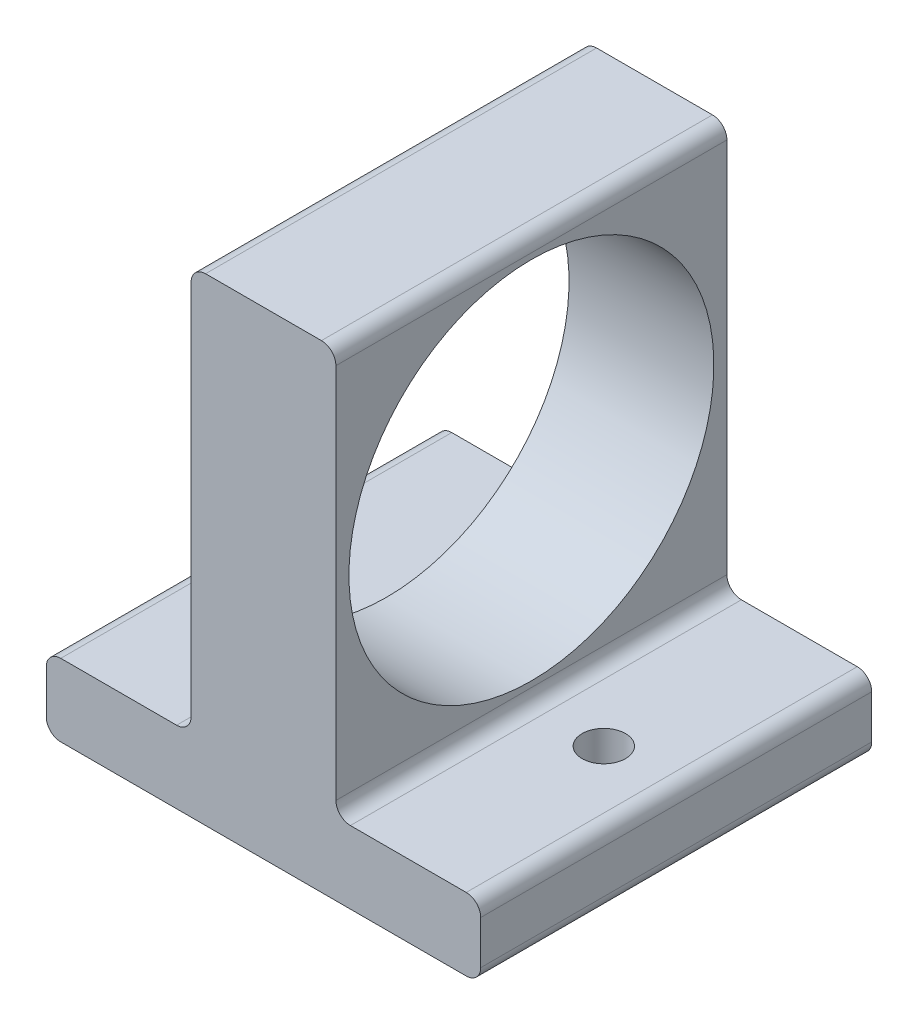
ISO-10303-21;
HEADER;
FILE_DESCRIPTION(('STEP AP214'),'2;1');
FILE_NAME('part.step','',(''),(''),'','','');
FILE_SCHEMA(('AUTOMOTIVE_DESIGN { 1 0 10303 214 1 1 1 1 }'));
ENDSEC;
DATA;
#1=APPLICATION_CONTEXT('core data for automotive mechanical design processes');
#2=APPLICATION_PROTOCOL_DEFINITION('international standard','automotive_design',2000,#1);
#3=PRODUCT_CONTEXT('',#1,'mechanical');
#4=PRODUCT('Part','Part','',(#3));
#5=PRODUCT_RELATED_PRODUCT_CATEGORY('part','',(#4));
#6=PRODUCT_DEFINITION_FORMATION('','',#4);
#7=PRODUCT_DEFINITION_CONTEXT('part definition',#1,'design');
#8=PRODUCT_DEFINITION('design','',#6,#7);
#9=PRODUCT_DEFINITION_SHAPE('','',#8);
#10=(LENGTH_UNIT() NAMED_UNIT(*) SI_UNIT(.MILLI.,.METRE.));
#11=(NAMED_UNIT(*) PLANE_ANGLE_UNIT() SI_UNIT($,.RADIAN.));
#12=(NAMED_UNIT(*) SI_UNIT($,.STERADIAN.) SOLID_ANGLE_UNIT());
#13=UNCERTAINTY_MEASURE_WITH_UNIT(LENGTH_MEASURE(1.E-05),#10,'distance_accuracy_value','');
#14=(GEOMETRIC_REPRESENTATION_CONTEXT(3) GLOBAL_UNCERTAINTY_ASSIGNED_CONTEXT((#13)) GLOBAL_UNIT_ASSIGNED_CONTEXT((#10,
#11,#12)) REPRESENTATION_CONTEXT('',''));
#15=CARTESIAN_POINT('',(0.,0.,0.));
#16=DIRECTION('',(0.,0.,1.));
#17=DIRECTION('',(1.,0.,0.));
#18=AXIS2_PLACEMENT_3D('',#15,#16,#17);
#19=CARTESIAN_POINT('',(-4.,27.,27.));
#20=DIRECTION('',(0.,0.,-1.));
#21=DIRECTION('',(-1.,0.,0.));
#22=AXIS2_PLACEMENT_3D('',#19,#20,#21);
#23=CYLINDRICAL_SURFACE('',#22,1.);
#24=CARTESIAN_POINT('',(-4.,27.,0.));
#25=DIRECTION('',(0.,0.,1.));
#26=DIRECTION('',(-1.,0.,0.));
#27=AXIS2_PLACEMENT_3D('',#24,#25,#26);
#28=CIRCLE('',#27,1.);
#29=CARTESIAN_POINT('',(-4.,28.,0.));
#30=VERTEX_POINT('',#29);
#31=CARTESIAN_POINT('',(-5.,27.,0.));
#32=VERTEX_POINT('',#31);
#33=EDGE_CURVE('E188',#30,#32,#28,.T.);
#34=ORIENTED_EDGE('',*,*,#33,.T.);
#35=DIRECTION('',(0.,0.,-1.));
#36=VECTOR('',#35,1.);
#37=CARTESIAN_POINT('',(-5.,27.,27.));
#38=LINE('',#37,#36);
#39=CARTESIAN_POINT('',(-5.,27.,27.));
#40=VERTEX_POINT('',#39);
#41=EDGE_CURVE('E11',#40,#32,#38,.T.);
#42=ORIENTED_EDGE('',*,*,#41,.F.);
#43=CARTESIAN_POINT('',(-4.,27.,27.));
#44=DIRECTION('',(0.,0.,1.));
#45=DIRECTION('',(-1.,0.,0.));
#46=AXIS2_PLACEMENT_3D('',#43,#44,#45);
#47=CIRCLE('',#46,1.);
#48=CARTESIAN_POINT('',(-4.,28.,27.));
#49=VERTEX_POINT('',#48);
#50=EDGE_CURVE('E235',#49,#40,#47,.T.);
#51=ORIENTED_EDGE('',*,*,#50,.F.);
#52=DIRECTION('',(0.,0.,-1.));
#53=VECTOR('',#52,1.);
#54=CARTESIAN_POINT('',(-4.,28.,27.));
#55=LINE('',#54,#53);
#56=EDGE_CURVE('E184',#49,#30,#55,.T.);
#57=ORIENTED_EDGE('',*,*,#56,.T.);
#58=EDGE_LOOP('',(#34,#42,#51,#57));
#59=FACE_BOUND('',#58,.T.);
#60=ADVANCED_FACE('F39',(#59),#23,.T.);
#61=CARTESIAN_POINT('',(-4.99999999999999,1.00000000000001,27.));
#62=DIRECTION('',(1.,0.,0.));
#63=DIRECTION('',(0.,1.,0.));
#64=AXIS2_PLACEMENT_3D('',#61,#62,#63);
#65=PLANE('',#64);
#66=CARTESIAN_POINT('',(-4.99999999999999,14.,13.5));
#67=DIRECTION('',(1.,0.,0.));
#68=DIRECTION('',(0.,1.,0.));
#69=AXIS2_PLACEMENT_3D('',#66,#67,#68);
#70=CIRCLE('',#69,12.6);
#71=CARTESIAN_POINT('',(-5.,26.6,13.5));
#72=VERTEX_POINT('',#71);
#73=EDGE_CURVE('E193',#72,#72,#70,.F.);
#74=ORIENTED_EDGE('',*,*,#73,.F.);
#75=EDGE_LOOP('',(#74));
#76=FACE_BOUND('',#75,.T.);
#77=DIRECTION('',(0.,-1.,0.));
#78=VECTOR('',#77,1.);
#79=CARTESIAN_POINT('',(-4.99999999999999,1.00000000000001,0.));
#80=LINE('',#79,#78);
#81=CARTESIAN_POINT('',(-4.99999999999999,1.00000000000001,0.));
#82=VERTEX_POINT('',#81);
#83=EDGE_CURVE('E192',#32,#82,#80,.T.);
#84=ORIENTED_EDGE('',*,*,#83,.T.);
#85=DIRECTION('',(0.,0.,-1.));
#86=VECTOR('',#85,1.);
#87=CARTESIAN_POINT('',(-4.99999999999999,1.00000000000001,27.));
#88=LINE('',#87,#86);
#89=CARTESIAN_POINT('',(-4.99999999999999,1.00000000000001,27.));
#90=VERTEX_POINT('',#89);
#91=EDGE_CURVE('E48',#90,#82,#88,.T.);
#92=ORIENTED_EDGE('',*,*,#91,.F.);
#93=DIRECTION('',(0.,-1.,0.));
#94=VECTOR('',#93,1.);
#95=CARTESIAN_POINT('',(-4.99999999999999,1.00000000000001,27.));
#96=LINE('',#95,#94);
#97=EDGE_CURVE('E123',#40,#90,#96,.T.);
#98=ORIENTED_EDGE('',*,*,#97,.F.);
#99=ORIENTED_EDGE('',*,*,#41,.T.);
#100=EDGE_LOOP('',(#84,#92,#98,#99));
#101=FACE_BOUND('',#100,.T.);
#102=ADVANCED_FACE('F357',(#76,#101),#65,.F.);
#103=CARTESIAN_POINT('',(-5.99999999999999,1.,27.));
#104=DIRECTION('',(0.,0.,-1.));
#105=DIRECTION('',(-1.,0.,0.));
#106=AXIS2_PLACEMENT_3D('',#103,#104,#105);
#107=CYLINDRICAL_SURFACE('',#106,1.);
#108=CARTESIAN_POINT('',(-5.99999999999999,1.,0.));
#109=DIRECTION('',(0.,0.,-1.));
#110=DIRECTION('',(1.,0.,0.));
#111=AXIS2_PLACEMENT_3D('',#108,#109,#110);
#112=CIRCLE('',#111,1.);
#113=CARTESIAN_POINT('',(-5.99999999999999,0.,0.));
#114=VERTEX_POINT('',#113);
#115=EDGE_CURVE('E196',#82,#114,#112,.T.);
#116=ORIENTED_EDGE('',*,*,#115,.T.);
#117=DIRECTION('',(0.,0.,-1.));
#118=VECTOR('',#117,1.);
#119=CARTESIAN_POINT('',(-5.99999999999999,0.,27.));
#120=LINE('',#119,#118);
#121=CARTESIAN_POINT('',(-5.99999999999999,0.,27.));
#122=VERTEX_POINT('',#121);
#123=EDGE_CURVE('E278',#122,#114,#120,.T.);
#124=ORIENTED_EDGE('',*,*,#123,.F.);
#125=CARTESIAN_POINT('',(-5.99999999999999,1.,27.));
#126=DIRECTION('',(0.,0.,-1.));
#127=DIRECTION('',(1.,0.,0.));
#128=AXIS2_PLACEMENT_3D('',#125,#126,#127);
#129=CIRCLE('',#128,1.);
#130=EDGE_CURVE('E288',#90,#122,#129,.T.);
#131=ORIENTED_EDGE('',*,*,#130,.F.);
#132=ORIENTED_EDGE('',*,*,#91,.T.);
#133=EDGE_LOOP('',(#116,#124,#131,#132));
#134=FACE_BOUND('',#133,.T.);
#135=ADVANCED_FACE('F286',(#134),#107,.F.);
#136=CARTESIAN_POINT('',(-14.,0.,27.));
#137=DIRECTION('',(0.,-1.,0.));
#138=DIRECTION('',(0.,0.,-1.));
#139=AXIS2_PLACEMENT_3D('',#136,#137,#138);
#140=PLANE('',#139);
#141=CARTESIAN_POINT('',(-10.,0.,13.5));
#142=DIRECTION('',(0.,-1.,0.));
#143=DIRECTION('',(0.,0.,-1.));
#144=AXIS2_PLACEMENT_3D('',#141,#142,#143);
#145=CIRCLE('',#144,1.5);
#146=CARTESIAN_POINT('',(-10.,0.,12.));
#147=VERTEX_POINT('',#146);
#148=EDGE_CURVE('E411',#147,#147,#145,.F.);
#149=ORIENTED_EDGE('',*,*,#148,.F.);
#150=EDGE_LOOP('',(#149));
#151=FACE_BOUND('',#150,.T.);
#152=DIRECTION('',(-1.,0.,0.));
#153=VECTOR('',#152,1.);
#154=CARTESIAN_POINT('',(-14.,0.,0.));
#155=LINE('',#154,#153);
#156=CARTESIAN_POINT('',(-14.,0.,0.));
#157=VERTEX_POINT('',#156);
#158=EDGE_CURVE('E199',#114,#157,#155,.T.);
#159=ORIENTED_EDGE('',*,*,#158,.T.);
#160=DIRECTION('',(0.,0.,-1.));
#161=VECTOR('',#160,1.);
#162=CARTESIAN_POINT('',(-14.,0.,27.));
#163=LINE('',#162,#161);
#164=CARTESIAN_POINT('',(-14.,0.,27.));
#165=VERTEX_POINT('',#164);
#166=EDGE_CURVE('E274',#165,#157,#163,.T.);
#167=ORIENTED_EDGE('',*,*,#166,.F.);
#168=DIRECTION('',(-1.,0.,0.));
#169=VECTOR('',#168,1.);
#170=CARTESIAN_POINT('',(-14.,0.,27.));
#171=LINE('',#170,#169);
#172=EDGE_CURVE('E307',#122,#165,#171,.T.);
#173=ORIENTED_EDGE('',*,*,#172,.F.);
#174=ORIENTED_EDGE('',*,*,#123,.T.);
#175=EDGE_LOOP('',(#159,#167,#173,#174));
#176=FACE_BOUND('',#175,.T.);
#177=ADVANCED_FACE('F297',(#151,#176),#140,.F.);
#178=CARTESIAN_POINT('',(-14.,-1.,27.));
#179=DIRECTION('',(0.,0.,-1.));
#180=DIRECTION('',(-1.,0.,0.));
#181=AXIS2_PLACEMENT_3D('',#178,#179,#180);
#182=CYLINDRICAL_SURFACE('',#181,1.);
#183=CARTESIAN_POINT('',(-14.,-1.,0.));
#184=DIRECTION('',(0.,0.,1.));
#185=DIRECTION('',(-1.,0.,0.));
#186=AXIS2_PLACEMENT_3D('',#183,#184,#185);
#187=CIRCLE('',#186,1.);
#188=CARTESIAN_POINT('',(-15.,-1.00000000000001,0.));
#189=VERTEX_POINT('',#188);
#190=EDGE_CURVE('E202',#157,#189,#187,.T.);
#191=ORIENTED_EDGE('',*,*,#190,.T.);
#192=DIRECTION('',(0.,0.,-1.));
#193=VECTOR('',#192,1.);
#194=CARTESIAN_POINT('',(-15.,-1.00000000000001,27.));
#195=LINE('',#194,#193);
#196=CARTESIAN_POINT('',(-15.,-1.00000000000001,27.));
#197=VERTEX_POINT('',#196);
#198=EDGE_CURVE('E270',#197,#189,#195,.T.);
#199=ORIENTED_EDGE('',*,*,#198,.F.);
#200=CARTESIAN_POINT('',(-14.,-1.,27.));
#201=DIRECTION('',(0.,0.,1.));
#202=DIRECTION('',(-1.,0.,0.));
#203=AXIS2_PLACEMENT_3D('',#200,#201,#202);
#204=CIRCLE('',#203,1.);
#205=EDGE_CURVE('E303',#165,#197,#204,.T.);
#206=ORIENTED_EDGE('',*,*,#205,.F.);
#207=ORIENTED_EDGE('',*,*,#166,.T.);
#208=EDGE_LOOP('',(#191,#199,#206,#207));
#209=FACE_BOUND('',#208,.T.);
#210=ADVANCED_FACE('F301',(#209),#182,.T.);
#211=CARTESIAN_POINT('',(-15.,-1.00000000000001,27.));
#212=DIRECTION('',(1.,0.,0.));
#213=DIRECTION('',(0.,0.,-1.));
#214=AXIS2_PLACEMENT_3D('',#211,#212,#213);
#215=PLANE('',#214);
#216=DIRECTION('',(0.,-1.,0.));
#217=VECTOR('',#216,1.);
#218=CARTESIAN_POINT('',(-15.,-1.00000000000001,0.));
#219=LINE('',#218,#217);
#220=CARTESIAN_POINT('',(-15.,-3.99999999999999,0.));
#221=VERTEX_POINT('',#220);
#222=EDGE_CURVE('E205',#189,#221,#219,.T.);
#223=ORIENTED_EDGE('',*,*,#222,.T.);
#224=DIRECTION('',(0.,0.,-1.));
#225=VECTOR('',#224,1.);
#226=CARTESIAN_POINT('',(-15.,-3.99999999999999,27.));
#227=LINE('',#226,#225);
#228=CARTESIAN_POINT('',(-15.,-3.99999999999999,27.));
#229=VERTEX_POINT('',#228);
#230=EDGE_CURVE('E266',#229,#221,#227,.T.);
#231=ORIENTED_EDGE('',*,*,#230,.F.);
#232=DIRECTION('',(0.,-1.,0.));
#233=VECTOR('',#232,1.);
#234=CARTESIAN_POINT('',(-15.,-1.00000000000001,27.));
#235=LINE('',#234,#233);
#236=EDGE_CURVE('E306',#197,#229,#235,.T.);
#237=ORIENTED_EDGE('',*,*,#236,.F.);
#238=ORIENTED_EDGE('',*,*,#198,.T.);
#239=EDGE_LOOP('',(#223,#231,#237,#238));
#240=FACE_BOUND('',#239,.T.);
#241=ADVANCED_FACE('F373',(#240),#215,.F.);
#242=CARTESIAN_POINT('',(-14.,-4.,27.));
#243=DIRECTION('',(0.,0.,-1.));
#244=DIRECTION('',(-1.,0.,0.));
#245=AXIS2_PLACEMENT_3D('',#242,#243,#244);
#246=CYLINDRICAL_SURFACE('',#245,1.);
#247=CARTESIAN_POINT('',(-14.,-4.,0.));
#248=DIRECTION('',(0.,0.,1.));
#249=DIRECTION('',(-1.,0.,0.));
#250=AXIS2_PLACEMENT_3D('',#247,#248,#249);
#251=CIRCLE('',#250,1.);
#252=CARTESIAN_POINT('',(-14.,-5.,0.));
#253=VERTEX_POINT('',#252);
#254=EDGE_CURVE('E208',#221,#253,#251,.T.);
#255=ORIENTED_EDGE('',*,*,#254,.T.);
#256=DIRECTION('',(0.,0.,-1.));
#257=VECTOR('',#256,1.);
#258=CARTESIAN_POINT('',(-14.,-5.,27.));
#259=LINE('',#258,#257);
#260=CARTESIAN_POINT('',(-14.,-5.,27.));
#261=VERTEX_POINT('',#260);
#262=EDGE_CURVE('E262',#261,#253,#259,.T.);
#263=ORIENTED_EDGE('',*,*,#262,.F.);
#264=CARTESIAN_POINT('',(-14.,-4.,27.));
#265=DIRECTION('',(0.,0.,1.));
#266=DIRECTION('',(-1.,0.,0.));
#267=AXIS2_PLACEMENT_3D('',#264,#265,#266);
#268=CIRCLE('',#267,1.);
#269=EDGE_CURVE('E311',#229,#261,#268,.T.);
#270=ORIENTED_EDGE('',*,*,#269,.F.);
#271=ORIENTED_EDGE('',*,*,#230,.T.);
#272=EDGE_LOOP('',(#255,#263,#270,#271));
#273=FACE_BOUND('',#272,.T.);
#274=ADVANCED_FACE('F376',(#273),#246,.T.);
#275=CARTESIAN_POINT('',(-14.,-5.,27.));
#276=DIRECTION('',(0.,1.,0.));
#277=DIRECTION('',(-1.,0.,0.));
#278=AXIS2_PLACEMENT_3D('',#275,#276,#277);
#279=PLANE('',#278);
#280=CARTESIAN_POINT('',(-10.,-5.,13.5));
#281=DIRECTION('',(0.,-1.,0.));
#282=DIRECTION('',(1.,0.,0.));
#283=AXIS2_PLACEMENT_3D('',#280,#281,#282);
#284=CIRCLE('',#283,1.5);
#285=CARTESIAN_POINT('',(-8.5,-5.,13.5));
#286=VERTEX_POINT('',#285);
#287=EDGE_CURVE('E418',#286,#286,#284,.T.);
#288=ORIENTED_EDGE('',*,*,#287,.F.);
#289=EDGE_LOOP('',(#288));
#290=FACE_BOUND('',#289,.T.);
#291=CARTESIAN_POINT('',(10.,-4.99999999999999,13.5));
#292=DIRECTION('',(0.,-1.,0.));
#293=DIRECTION('',(-1.,0.,0.));
#294=AXIS2_PLACEMENT_3D('',#291,#292,#293);
#295=CIRCLE('',#294,1.5);
#296=CARTESIAN_POINT('',(8.50000000000001,-4.99999999999999,13.5));
#297=VERTEX_POINT('',#296);
#298=EDGE_CURVE('E430',#297,#297,#295,.T.);
#299=ORIENTED_EDGE('',*,*,#298,.F.);
#300=EDGE_LOOP('',(#299));
#301=FACE_BOUND('',#300,.T.);
#302=DIRECTION('',(1.,0.,0.));
#303=VECTOR('',#302,1.);
#304=CARTESIAN_POINT('',(-14.,-5.,0.));
#305=LINE('',#304,#303);
#306=CARTESIAN_POINT('',(14.,-4.99999999999999,0.));
#307=VERTEX_POINT('',#306);
#308=EDGE_CURVE('E211',#253,#307,#305,.T.);
#309=ORIENTED_EDGE('',*,*,#308,.T.);
#310=DIRECTION('',(0.,0.,-1.));
#311=VECTOR('',#310,1.);
#312=CARTESIAN_POINT('',(14.,-4.99999999999999,27.));
#313=LINE('',#312,#311);
#314=CARTESIAN_POINT('',(14.,-4.99999999999999,27.));
#315=VERTEX_POINT('',#314);
#316=EDGE_CURVE('E258',#315,#307,#313,.T.);
#317=ORIENTED_EDGE('',*,*,#316,.F.);
#318=DIRECTION('',(1.,0.,0.));
#319=VECTOR('',#318,1.);
#320=CARTESIAN_POINT('',(-14.,-5.,27.));
#321=LINE('',#320,#319);
#322=EDGE_CURVE('E318',#261,#315,#321,.T.);
#323=ORIENTED_EDGE('',*,*,#322,.F.);
#324=ORIENTED_EDGE('',*,*,#262,.T.);
#325=EDGE_LOOP('',(#309,#317,#323,#324));
#326=FACE_BOUND('',#325,.T.);
#327=ADVANCED_FACE('F380',(#290,#301,#326),#279,.F.);
#328=CARTESIAN_POINT('',(14.,-3.99999999999999,27.));
#329=DIRECTION('',(0.,0.,-1.));
#330=DIRECTION('',(-1.,0.,0.));
#331=AXIS2_PLACEMENT_3D('',#328,#329,#330);
#332=CYLINDRICAL_SURFACE('',#331,1.);
#333=CARTESIAN_POINT('',(14.,-3.99999999999999,0.));
#334=DIRECTION('',(0.,0.,1.));
#335=DIRECTION('',(1.,0.,0.));
#336=AXIS2_PLACEMENT_3D('',#333,#334,#335);
#337=CIRCLE('',#336,1.);
#338=CARTESIAN_POINT('',(15.,-3.99999999999999,0.));
#339=VERTEX_POINT('',#338);
#340=EDGE_CURVE('E214',#307,#339,#337,.T.);
#341=ORIENTED_EDGE('',*,*,#340,.T.);
#342=DIRECTION('',(0.,0.,-1.));
#343=VECTOR('',#342,1.);
#344=CARTESIAN_POINT('',(15.,-3.99999999999999,27.));
#345=LINE('',#344,#343);
#346=CARTESIAN_POINT('',(15.,-3.99999999999999,27.));
#347=VERTEX_POINT('',#346);
#348=EDGE_CURVE('E254',#347,#339,#345,.T.);
#349=ORIENTED_EDGE('',*,*,#348,.F.);
#350=CARTESIAN_POINT('',(14.,-3.99999999999999,27.));
#351=DIRECTION('',(0.,0.,1.));
#352=DIRECTION('',(1.,0.,0.));
#353=AXIS2_PLACEMENT_3D('',#350,#351,#352);
#354=CIRCLE('',#353,1.);
#355=EDGE_CURVE('E321',#315,#347,#354,.T.);
#356=ORIENTED_EDGE('',*,*,#355,.F.);
#357=ORIENTED_EDGE('',*,*,#316,.T.);
#358=EDGE_LOOP('',(#341,#349,#356,#357));
#359=FACE_BOUND('',#358,.T.);
#360=ADVANCED_FACE('F384',(#359),#332,.T.);
#361=CARTESIAN_POINT('',(15.,-1.,27.));
#362=DIRECTION('',(-1.,0.,0.));
#363=DIRECTION('',(0.,0.,1.));
#364=AXIS2_PLACEMENT_3D('',#361,#362,#363);
#365=PLANE('',#364);
#366=DIRECTION('',(0.,1.,0.));
#367=VECTOR('',#366,1.);
#368=CARTESIAN_POINT('',(15.,-1.,0.));
#369=LINE('',#368,#367);
#370=CARTESIAN_POINT('',(15.,-1.,0.));
#371=VERTEX_POINT('',#370);
#372=EDGE_CURVE('E217',#339,#371,#369,.T.);
#373=ORIENTED_EDGE('',*,*,#372,.T.);
#374=DIRECTION('',(0.,0.,-1.));
#375=VECTOR('',#374,1.);
#376=CARTESIAN_POINT('',(15.,-1.,27.));
#377=LINE('',#376,#375);
#378=CARTESIAN_POINT('',(15.,-1.,27.));
#379=VERTEX_POINT('',#378);
#380=EDGE_CURVE('E250',#379,#371,#377,.T.);
#381=ORIENTED_EDGE('',*,*,#380,.F.);
#382=DIRECTION('',(0.,1.,0.));
#383=VECTOR('',#382,1.);
#384=CARTESIAN_POINT('',(15.,-1.,27.));
#385=LINE('',#384,#383);
#386=EDGE_CURVE('E324',#347,#379,#385,.T.);
#387=ORIENTED_EDGE('',*,*,#386,.F.);
#388=ORIENTED_EDGE('',*,*,#348,.T.);
#389=EDGE_LOOP('',(#373,#381,#387,#388));
#390=FACE_BOUND('',#389,.T.);
#391=ADVANCED_FACE('F388',(#390),#365,.F.);
#392=CARTESIAN_POINT('',(14.,-0.999999999999993,27.));
#393=DIRECTION('',(0.,0.,-1.));
#394=DIRECTION('',(-1.,0.,0.));
#395=AXIS2_PLACEMENT_3D('',#392,#393,#394);
#396=CYLINDRICAL_SURFACE('',#395,1.);
#397=CARTESIAN_POINT('',(14.,-0.999999999999993,0.));
#398=DIRECTION('',(0.,0.,1.));
#399=DIRECTION('',(1.,0.,0.));
#400=AXIS2_PLACEMENT_3D('',#397,#398,#399);
#401=CIRCLE('',#400,1.);
#402=CARTESIAN_POINT('',(14.,0.,0.));
#403=VERTEX_POINT('',#402);
#404=EDGE_CURVE('E220',#371,#403,#401,.T.);
#405=ORIENTED_EDGE('',*,*,#404,.T.);
#406=DIRECTION('',(0.,0.,-1.));
#407=VECTOR('',#406,1.);
#408=CARTESIAN_POINT('',(14.,0.,27.));
#409=LINE('',#408,#407);
#410=CARTESIAN_POINT('',(14.,0.,27.));
#411=VERTEX_POINT('',#410);
#412=EDGE_CURVE('E246',#411,#403,#409,.T.);
#413=ORIENTED_EDGE('',*,*,#412,.F.);
#414=CARTESIAN_POINT('',(14.,-0.999999999999993,27.));
#415=DIRECTION('',(0.,0.,1.));
#416=DIRECTION('',(1.,0.,0.));
#417=AXIS2_PLACEMENT_3D('',#414,#415,#416);
#418=CIRCLE('',#417,1.);
#419=EDGE_CURVE('E327',#379,#411,#418,.T.);
#420=ORIENTED_EDGE('',*,*,#419,.F.);
#421=ORIENTED_EDGE('',*,*,#380,.T.);
#422=EDGE_LOOP('',(#405,#413,#420,#421));
#423=FACE_BOUND('',#422,.T.);
#424=ADVANCED_FACE('F392',(#423),#396,.T.);
#425=CARTESIAN_POINT('',(14.,0.,27.));
#426=DIRECTION('',(0.,-1.,0.));
#427=DIRECTION('',(0.,0.,-1.));
#428=AXIS2_PLACEMENT_3D('',#425,#426,#427);
#429=PLANE('',#428);
#430=CARTESIAN_POINT('',(10.,0.,13.5));
#431=DIRECTION('',(0.,-1.,0.));
#432=DIRECTION('',(0.,0.,-1.));
#433=AXIS2_PLACEMENT_3D('',#430,#431,#432);
#434=CIRCLE('',#433,1.5);
#435=CARTESIAN_POINT('',(10.,0.,12.));
#436=VERTEX_POINT('',#435);
#437=EDGE_CURVE('E421',#436,#436,#434,.F.);
#438=ORIENTED_EDGE('',*,*,#437,.F.);
#439=EDGE_LOOP('',(#438));
#440=FACE_BOUND('',#439,.T.);
#441=DIRECTION('',(-1.,0.,0.));
#442=VECTOR('',#441,1.);
#443=CARTESIAN_POINT('',(14.,0.,0.));
#444=LINE('',#443,#442);
#445=CARTESIAN_POINT('',(5.99999999999999,0.,0.));
#446=VERTEX_POINT('',#445);
#447=EDGE_CURVE('E223',#403,#446,#444,.T.);
#448=ORIENTED_EDGE('',*,*,#447,.T.);
#449=DIRECTION('',(0.,0.,-1.));
#450=VECTOR('',#449,1.);
#451=CARTESIAN_POINT('',(5.99999999999999,0.,27.));
#452=LINE('',#451,#450);
#453=CARTESIAN_POINT('',(5.99999999999999,0.,27.));
#454=VERTEX_POINT('',#453);
#455=EDGE_CURVE('E242',#454,#446,#452,.T.);
#456=ORIENTED_EDGE('',*,*,#455,.F.);
#457=DIRECTION('',(-1.,0.,0.));
#458=VECTOR('',#457,1.);
#459=CARTESIAN_POINT('',(14.,0.,27.));
#460=LINE('',#459,#458);
#461=EDGE_CURVE('E330',#411,#454,#460,.T.);
#462=ORIENTED_EDGE('',*,*,#461,.F.);
#463=ORIENTED_EDGE('',*,*,#412,.T.);
#464=EDGE_LOOP('',(#448,#456,#462,#463));
#465=FACE_BOUND('',#464,.T.);
#466=ADVANCED_FACE('F338',(#440,#465),#429,.F.);
#467=CARTESIAN_POINT('',(5.99999999999999,1.00000000000001,27.));
#468=DIRECTION('',(0.,0.,-1.));
#469=DIRECTION('',(-1.,0.,0.));
#470=AXIS2_PLACEMENT_3D('',#467,#468,#469);
#471=CYLINDRICAL_SURFACE('',#470,1.);
#472=CARTESIAN_POINT('',(5.99999999999999,1.00000000000001,0.));
#473=DIRECTION('',(0.,0.,-1.));
#474=DIRECTION('',(-1.,0.,0.));
#475=AXIS2_PLACEMENT_3D('',#472,#473,#474);
#476=CIRCLE('',#475,1.);
#477=CARTESIAN_POINT('',(4.99999999999999,1.00000000000001,0.));
#478=VERTEX_POINT('',#477);
#479=EDGE_CURVE('E226',#446,#478,#476,.T.);
#480=ORIENTED_EDGE('',*,*,#479,.T.);
#481=DIRECTION('',(0.,0.,-1.));
#482=VECTOR('',#481,1.);
#483=CARTESIAN_POINT('',(4.99999999999999,1.00000000000001,27.));
#484=LINE('',#483,#482);
#485=CARTESIAN_POINT('',(4.99999999999999,1.00000000000001,27.));
#486=VERTEX_POINT('',#485);
#487=EDGE_CURVE('E177',#486,#478,#484,.T.);
#488=ORIENTED_EDGE('',*,*,#487,.F.);
#489=CARTESIAN_POINT('',(5.99999999999999,1.00000000000001,27.));
#490=DIRECTION('',(0.,0.,-1.));
#491=DIRECTION('',(-1.,0.,0.));
#492=AXIS2_PLACEMENT_3D('',#489,#490,#491);
#493=CIRCLE('',#492,1.);
#494=EDGE_CURVE('E166',#454,#486,#493,.T.);
#495=ORIENTED_EDGE('',*,*,#494,.F.);
#496=ORIENTED_EDGE('',*,*,#455,.T.);
#497=EDGE_LOOP('',(#480,#488,#495,#496));
#498=FACE_BOUND('',#497,.T.);
#499=ADVANCED_FACE('F342',(#498),#471,.F.);
#500=CARTESIAN_POINT('',(4.99999999999999,1.00000000000001,27.));
#501=DIRECTION('',(-1.,0.,0.));
#502=DIRECTION('',(0.,-1.,0.));
#503=AXIS2_PLACEMENT_3D('',#500,#501,#502);
#504=PLANE('',#503);
#505=CARTESIAN_POINT('',(5.,14.,13.5));
#506=DIRECTION('',(1.,0.,0.));
#507=DIRECTION('',(0.,1.,0.));
#508=AXIS2_PLACEMENT_3D('',#505,#506,#507);
#509=CIRCLE('',#508,12.6);
#510=CARTESIAN_POINT('',(5.00000000000001,26.6,13.5));
#511=VERTEX_POINT('',#510);
#512=EDGE_CURVE('E408',#511,#511,#509,.T.);
#513=ORIENTED_EDGE('',*,*,#512,.F.);
#514=EDGE_LOOP('',(#513));
#515=FACE_BOUND('',#514,.T.);
#516=DIRECTION('',(0.,1.,0.));
#517=VECTOR('',#516,1.);
#518=CARTESIAN_POINT('',(4.99999999999999,1.00000000000001,0.));
#519=LINE('',#518,#517);
#520=CARTESIAN_POINT('',(5.,27.,0.));
#521=VERTEX_POINT('',#520);
#522=EDGE_CURVE('E175',#478,#521,#519,.T.);
#523=ORIENTED_EDGE('',*,*,#522,.T.);
#524=DIRECTION('',(0.,0.,-1.));
#525=VECTOR('',#524,1.);
#526=CARTESIAN_POINT('',(5.,27.,27.));
#527=LINE('',#526,#525);
#528=CARTESIAN_POINT('',(5.,27.,27.));
#529=VERTEX_POINT('',#528);
#530=EDGE_CURVE('E172',#529,#521,#527,.T.);
#531=ORIENTED_EDGE('',*,*,#530,.F.);
#532=DIRECTION('',(0.,1.,0.));
#533=VECTOR('',#532,1.);
#534=CARTESIAN_POINT('',(4.99999999999999,1.00000000000001,27.));
#535=LINE('',#534,#533);
#536=EDGE_CURVE('E160',#486,#529,#535,.T.);
#537=ORIENTED_EDGE('',*,*,#536,.F.);
#538=ORIENTED_EDGE('',*,*,#487,.T.);
#539=EDGE_LOOP('',(#523,#531,#537,#538));
#540=FACE_BOUND('',#539,.T.);
#541=ADVANCED_FACE('F173',(#515,#540),#504,.F.);
#542=CARTESIAN_POINT('',(4.,27.,27.));
#543=DIRECTION('',(0.,0.,-1.));
#544=DIRECTION('',(-1.,0.,0.));
#545=AXIS2_PLACEMENT_3D('',#542,#543,#544);
#546=CYLINDRICAL_SURFACE('',#545,1.);
#547=CARTESIAN_POINT('',(4.,27.,0.));
#548=DIRECTION('',(0.,0.,1.));
#549=DIRECTION('',(1.,0.,0.));
#550=AXIS2_PLACEMENT_3D('',#547,#548,#549);
#551=CIRCLE('',#550,1.);
#552=CARTESIAN_POINT('',(4.,28.,0.));
#553=VERTEX_POINT('',#552);
#554=EDGE_CURVE('E109',#521,#553,#551,.T.);
#555=ORIENTED_EDGE('',*,*,#554,.T.);
#556=DIRECTION('',(0.,0.,-1.));
#557=VECTOR('',#556,1.);
#558=CARTESIAN_POINT('',(4.,28.,27.));
#559=LINE('',#558,#557);
#560=CARTESIAN_POINT('',(4.,28.,27.));
#561=VERTEX_POINT('',#560);
#562=EDGE_CURVE('E178',#561,#553,#559,.T.);
#563=ORIENTED_EDGE('',*,*,#562,.F.);
#564=CARTESIAN_POINT('',(4.,27.,27.));
#565=DIRECTION('',(0.,0.,1.));
#566=DIRECTION('',(1.,0.,0.));
#567=AXIS2_PLACEMENT_3D('',#564,#565,#566);
#568=CIRCLE('',#567,1.);
#569=EDGE_CURVE('E164',#529,#561,#568,.T.);
#570=ORIENTED_EDGE('',*,*,#569,.F.);
#571=ORIENTED_EDGE('',*,*,#530,.T.);
#572=EDGE_LOOP('',(#555,#563,#570,#571));
#573=FACE_BOUND('',#572,.T.);
#574=ADVANCED_FACE('F180',(#573),#546,.T.);
#575=CARTESIAN_POINT('',(-4.,28.,27.));
#576=DIRECTION('',(0.,-1.,0.));
#577=DIRECTION('',(0.,0.,-1.));
#578=AXIS2_PLACEMENT_3D('',#575,#576,#577);
#579=PLANE('',#578);
#580=DIRECTION('',(-1.,0.,0.));
#581=VECTOR('',#580,1.);
#582=CARTESIAN_POINT('',(-4.,28.,0.));
#583=LINE('',#582,#581);
#584=EDGE_CURVE('E115',#553,#30,#583,.T.);
#585=ORIENTED_EDGE('',*,*,#584,.T.);
#586=ORIENTED_EDGE('',*,*,#56,.F.);
#587=DIRECTION('',(-1.,0.,0.));
#588=VECTOR('',#587,1.);
#589=CARTESIAN_POINT('',(-4.,28.,27.));
#590=LINE('',#589,#588);
#591=EDGE_CURVE('E56',#561,#49,#590,.T.);
#592=ORIENTED_EDGE('',*,*,#591,.F.);
#593=ORIENTED_EDGE('',*,*,#562,.T.);
#594=EDGE_LOOP('',(#585,#586,#592,#593));
#595=FACE_BOUND('',#594,.T.);
#596=ADVANCED_FACE('F346',(#595),#579,.F.);
#597=CARTESIAN_POINT('',(-4.,27.,27.));
#598=DIRECTION('',(0.,0.,-1.));
#599=DIRECTION('',(-1.,0.,0.));
#600=AXIS2_PLACEMENT_3D('',#597,#598,#599);
#601=PLANE('',#600);
#602=ORIENTED_EDGE('',*,*,#50,.T.);
#603=ORIENTED_EDGE('',*,*,#97,.T.);
#604=ORIENTED_EDGE('',*,*,#130,.T.);
#605=ORIENTED_EDGE('',*,*,#172,.T.);
#606=ORIENTED_EDGE('',*,*,#205,.T.);
#607=ORIENTED_EDGE('',*,*,#236,.T.);
#608=ORIENTED_EDGE('',*,*,#269,.T.);
#609=ORIENTED_EDGE('',*,*,#322,.T.);
#610=ORIENTED_EDGE('',*,*,#355,.T.);
#611=ORIENTED_EDGE('',*,*,#386,.T.);
#612=ORIENTED_EDGE('',*,*,#419,.T.);
#613=ORIENTED_EDGE('',*,*,#461,.T.);
#614=ORIENTED_EDGE('',*,*,#494,.T.);
#615=ORIENTED_EDGE('',*,*,#536,.T.);
#616=ORIENTED_EDGE('',*,*,#569,.T.);
#617=ORIENTED_EDGE('',*,*,#591,.T.);
#618=EDGE_LOOP('',(#602,#603,#604,#605,#606,#607,#608,#609,#610,#611,#612,#613,#614,#615,#616,#617));
#619=FACE_BOUND('',#618,.T.);
#620=ADVANCED_FACE('F162',(#619),#601,.F.);
#621=CARTESIAN_POINT('',(-4.,27.,0.));
#622=DIRECTION('',(0.,0.,-1.));
#623=DIRECTION('',(-1.,0.,0.));
#624=AXIS2_PLACEMENT_3D('',#621,#622,#623);
#625=PLANE('',#624);
#626=ORIENTED_EDGE('',*,*,#33,.F.);
#627=ORIENTED_EDGE('',*,*,#584,.F.);
#628=ORIENTED_EDGE('',*,*,#554,.F.);
#629=ORIENTED_EDGE('',*,*,#522,.F.);
#630=ORIENTED_EDGE('',*,*,#479,.F.);
#631=ORIENTED_EDGE('',*,*,#447,.F.);
#632=ORIENTED_EDGE('',*,*,#404,.F.);
#633=ORIENTED_EDGE('',*,*,#372,.F.);
#634=ORIENTED_EDGE('',*,*,#340,.F.);
#635=ORIENTED_EDGE('',*,*,#308,.F.);
#636=ORIENTED_EDGE('',*,*,#254,.F.);
#637=ORIENTED_EDGE('',*,*,#222,.F.);
#638=ORIENTED_EDGE('',*,*,#190,.F.);
#639=ORIENTED_EDGE('',*,*,#158,.F.);
#640=ORIENTED_EDGE('',*,*,#115,.F.);
#641=ORIENTED_EDGE('',*,*,#83,.F.);
#642=EDGE_LOOP('',(#626,#627,#628,#629,#630,#631,#632,#633,#634,#635,#636,#637,#638,#639,#640,#641));
#643=FACE_BOUND('',#642,.T.);
#644=ADVANCED_FACE('F292',(#643),#625,.T.);
#645=CARTESIAN_POINT('',(-15.001,14.,13.5));
#646=DIRECTION('',(1.,0.,0.));
#647=DIRECTION('',(0.,1.,0.));
#648=AXIS2_PLACEMENT_3D('',#645,#646,#647);
#649=CYLINDRICAL_SURFACE('',#648,12.6);
#650=ORIENTED_EDGE('',*,*,#512,.T.);
#651=EDGE_LOOP('',(#650));
#652=FACE_BOUND('',#651,.T.);
#653=ORIENTED_EDGE('',*,*,#73,.T.);
#654=EDGE_LOOP('',(#653));
#655=FACE_BOUND('',#654,.T.);
#656=ADVANCED_FACE('F461',(#652,#655),#649,.F.);
#657=CARTESIAN_POINT('',(9.99999999999999,28.001,13.5));
#658=DIRECTION('',(0.,-1.,0.));
#659=DIRECTION('',(1.,0.,0.));
#660=AXIS2_PLACEMENT_3D('',#657,#658,#659);
#661=CYLINDRICAL_SURFACE('',#660,1.5);
#662=ORIENTED_EDGE('',*,*,#298,.T.);
#663=EDGE_LOOP('',(#662));
#664=FACE_BOUND('',#663,.T.);
#665=ORIENTED_EDGE('',*,*,#437,.T.);
#666=EDGE_LOOP('',(#665));
#667=FACE_BOUND('',#666,.T.);
#668=ADVANCED_FACE('F458',(#664,#667),#661,.F.);
#669=CARTESIAN_POINT('',(-10.,28.001,13.5));
#670=DIRECTION('',(0.,-1.,0.));
#671=DIRECTION('',(1.,0.,0.));
#672=AXIS2_PLACEMENT_3D('',#669,#670,#671);
#673=CYLINDRICAL_SURFACE('',#672,1.5);
#674=ORIENTED_EDGE('',*,*,#287,.T.);
#675=EDGE_LOOP('',(#674));
#676=FACE_BOUND('',#675,.T.);
#677=ORIENTED_EDGE('',*,*,#148,.T.);
#678=EDGE_LOOP('',(#677));
#679=FACE_BOUND('',#678,.T.);
#680=ADVANCED_FACE('F438',(#676,#679),#673,.F.);
#681=CLOSED_SHELL('',(#60,#102,#135,#177,#210,#241,#274,#327,#360,#391,#424,#466,#499,#541,#574,
#596,#620,#644,#656,#668,#680));
#682=MANIFOLD_SOLID_BREP('B2',#681);
#683=ADVANCED_BREP_SHAPE_REPRESENTATION('',(#18,#682),#14);
#684=SHAPE_DEFINITION_REPRESENTATION(#9,#683);
ENDSEC;
END-ISO-10303-21;
